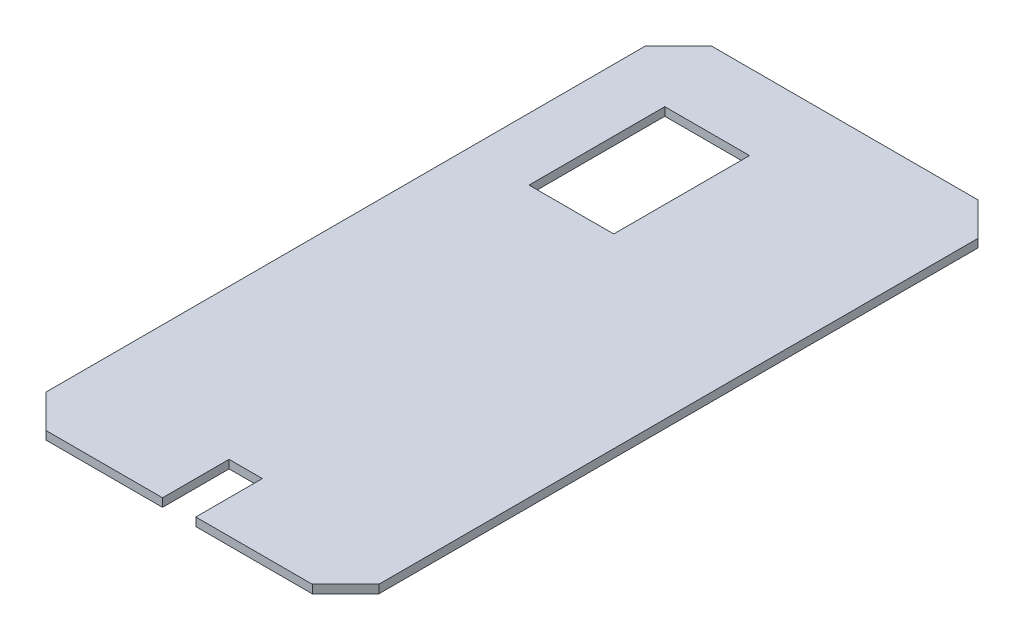
ISO-10303-21;
HEADER;
FILE_DESCRIPTION(('STEP AP214'),'2;1');
FILE_NAME('part.step','',(''),(''),'','','');
FILE_SCHEMA(('AUTOMOTIVE_DESIGN { 1 0 10303 214 1 1 1 1 }'));
ENDSEC;
DATA;
#1=APPLICATION_CONTEXT('core data for automotive mechanical design processes');
#2=APPLICATION_PROTOCOL_DEFINITION('international standard','automotive_design',2000,#1);
#3=PRODUCT_CONTEXT('',#1,'mechanical');
#4=PRODUCT('Part','Part','',(#3));
#5=PRODUCT_RELATED_PRODUCT_CATEGORY('part','',(#4));
#6=PRODUCT_DEFINITION_FORMATION('','',#4);
#7=PRODUCT_DEFINITION_CONTEXT('part definition',#1,'design');
#8=PRODUCT_DEFINITION('design','',#6,#7);
#9=PRODUCT_DEFINITION_SHAPE('','',#8);
#10=(LENGTH_UNIT() NAMED_UNIT(*) SI_UNIT(.MILLI.,.METRE.));
#11=(NAMED_UNIT(*) PLANE_ANGLE_UNIT() SI_UNIT($,.RADIAN.));
#12=(NAMED_UNIT(*) SI_UNIT($,.STERADIAN.) SOLID_ANGLE_UNIT());
#13=UNCERTAINTY_MEASURE_WITH_UNIT(LENGTH_MEASURE(1.E-05),#10,'distance_accuracy_value','');
#14=(GEOMETRIC_REPRESENTATION_CONTEXT(3) GLOBAL_UNCERTAINTY_ASSIGNED_CONTEXT((#13)) GLOBAL_UNIT_ASSIGNED_CONTEXT((#10,
#11,#12)) REPRESENTATION_CONTEXT('',''));
#15=CARTESIAN_POINT('',(0.,0.,0.));
#16=DIRECTION('',(0.,0.,1.));
#17=DIRECTION('',(1.,0.,0.));
#18=AXIS2_PLACEMENT_3D('',#15,#16,#17);
#19=CARTESIAN_POINT('',(0.,3.175,-225.052723408065));
#20=DIRECTION('',(0.,0.,-1.));
#21=DIRECTION('',(-1.,0.,0.));
#22=AXIS2_PLACEMENT_3D('',#19,#20,#21);
#23=PLANE('',#22);
#24=DIRECTION('',(1.,0.,0.));
#25=VECTOR('',#24,1.);
#26=CARTESIAN_POINT('',(0.,0.,-225.052723408065));
#27=LINE('',#26,#25);
#28=CARTESIAN_POINT('',(23.7518882863376,0.,-225.052723408065));
#29=VERTEX_POINT('',#28);
#30=CARTESIAN_POINT('',(56.0621871408209,0.,-225.052723408065));
#31=VERTEX_POINT('',#30);
#32=EDGE_CURVE('E214',#29,#31,#27,.T.);
#33=ORIENTED_EDGE('',*,*,#32,.T.);
#34=DIRECTION('',(0.,-1.,0.));
#35=VECTOR('',#34,1.);
#36=CARTESIAN_POINT('',(56.0621871408209,3.175,-225.052723408065));
#37=LINE('',#36,#35);
#38=CARTESIAN_POINT('',(56.0621871408209,3.175,-225.052723408065));
#39=VERTEX_POINT('',#38);
#40=EDGE_CURVE('E11',#39,#31,#37,.T.);
#41=ORIENTED_EDGE('',*,*,#40,.F.);
#42=DIRECTION('',(1.,0.,0.));
#43=VECTOR('',#42,1.);
#44=CARTESIAN_POINT('',(0.,3.175,-225.052723408065));
#45=LINE('',#44,#43);
#46=CARTESIAN_POINT('',(23.7518882863376,3.175,-225.052723408065));
#47=VERTEX_POINT('',#46);
#48=EDGE_CURVE('E163',#47,#39,#45,.T.);
#49=ORIENTED_EDGE('',*,*,#48,.F.);
#50=DIRECTION('',(0.,-1.,0.));
#51=VECTOR('',#50,1.);
#52=CARTESIAN_POINT('',(23.7518882863376,3.175,-225.052723408065));
#53=LINE('',#52,#51);
#54=EDGE_CURVE('E54',#47,#29,#53,.T.);
#55=ORIENTED_EDGE('',*,*,#54,.T.);
#56=EDGE_LOOP('',(#33,#41,#49,#55));
#57=FACE_BOUND('',#56,.T.);
#58=ADVANCED_FACE('F35',(#57),#23,.F.);
#59=CARTESIAN_POINT('',(56.0621871408209,3.175,0.));
#60=DIRECTION('',(1.,0.,0.));
#61=DIRECTION('',(0.,0.,-1.));
#62=AXIS2_PLACEMENT_3D('',#59,#60,#61);
#63=PLANE('',#62);
#64=DIRECTION('',(0.,0.,1.));
#65=VECTOR('',#64,1.);
#66=CARTESIAN_POINT('',(56.0621871408209,0.,0.));
#67=LINE('',#66,#65);
#68=CARTESIAN_POINT('',(56.0621871408209,0.,-173.247459444421));
#69=VERTEX_POINT('',#68);
#70=EDGE_CURVE('E169',#31,#69,#67,.T.);
#71=ORIENTED_EDGE('',*,*,#70,.T.);
#72=DIRECTION('',(0.,-1.,0.));
#73=VECTOR('',#72,1.);
#74=CARTESIAN_POINT('',(56.0621871408209,3.175,-173.247459444421));
#75=LINE('',#74,#73);
#76=CARTESIAN_POINT('',(56.0621871408209,3.175,-173.247459444421));
#77=VERTEX_POINT('',#76);
#78=EDGE_CURVE('E45',#77,#69,#75,.T.);
#79=ORIENTED_EDGE('',*,*,#78,.F.);
#80=DIRECTION('',(0.,0.,1.));
#81=VECTOR('',#80,1.);
#82=CARTESIAN_POINT('',(56.0621871408209,3.175,0.));
#83=LINE('',#82,#81);
#84=EDGE_CURVE('E157',#39,#77,#83,.T.);
#85=ORIENTED_EDGE('',*,*,#84,.F.);
#86=ORIENTED_EDGE('',*,*,#40,.T.);
#87=EDGE_LOOP('',(#71,#79,#85,#86));
#88=FACE_BOUND('',#87,.T.);
#89=ADVANCED_FACE('F168',(#88),#63,.F.);
#90=CARTESIAN_POINT('',(0.,3.175,-173.247459444421));
#91=DIRECTION('',(0.,0.,-1.));
#92=DIRECTION('',(-1.,0.,0.));
#93=AXIS2_PLACEMENT_3D('',#90,#91,#92);
#94=PLANE('',#93);
#95=DIRECTION('',(1.,0.,0.));
#96=VECTOR('',#95,1.);
#97=CARTESIAN_POINT('',(0.,0.,-173.247459444421));
#98=LINE('',#97,#96);
#99=CARTESIAN_POINT('',(23.7518882863376,0.,-173.247459444421));
#100=VERTEX_POINT('',#99);
#101=EDGE_CURVE('E217',#100,#69,#98,.T.);
#102=ORIENTED_EDGE('',*,*,#101,.F.);
#103=DIRECTION('',(0.,-1.,0.));
#104=VECTOR('',#103,1.);
#105=CARTESIAN_POINT('',(23.7518882863376,3.175,-173.247459444421));
#106=LINE('',#105,#104);
#107=CARTESIAN_POINT('',(23.7518882863376,3.175,-173.247459444421));
#108=VERTEX_POINT('',#107);
#109=EDGE_CURVE('E104',#108,#100,#106,.T.);
#110=ORIENTED_EDGE('',*,*,#109,.F.);
#111=DIRECTION('',(1.,0.,0.));
#112=VECTOR('',#111,1.);
#113=CARTESIAN_POINT('',(0.,3.175,-173.247459444421));
#114=LINE('',#113,#112);
#115=EDGE_CURVE('E162',#108,#77,#114,.T.);
#116=ORIENTED_EDGE('',*,*,#115,.T.);
#117=ORIENTED_EDGE('',*,*,#78,.T.);
#118=EDGE_LOOP('',(#102,#110,#116,#117));
#119=FACE_BOUND('',#118,.T.);
#120=ADVANCED_FACE('F173',(#119),#94,.T.);
#121=CARTESIAN_POINT('',(0.,3.175,-25.4));
#122=DIRECTION('',(0.,0.,-1.));
#123=DIRECTION('',(-1.,0.,0.));
#124=AXIS2_PLACEMENT_3D('',#121,#122,#123);
#125=PLANE('',#124);
#126=DIRECTION('',(1.,0.,0.));
#127=VECTOR('',#126,1.);
#128=CARTESIAN_POINT('',(0.,0.,-25.4));
#129=LINE('',#128,#127);
#130=CARTESIAN_POINT('',(57.1499999999994,0.,-25.4));
#131=VERTEX_POINT('',#130);
#132=CARTESIAN_POINT('',(69.8499999999994,0.,-25.4));
#133=VERTEX_POINT('',#132);
#134=EDGE_CURVE('E180',#131,#133,#129,.T.);
#135=ORIENTED_EDGE('',*,*,#134,.T.);
#136=DIRECTION('',(0.,-1.,0.));
#137=VECTOR('',#136,1.);
#138=CARTESIAN_POINT('',(69.8499999999994,3.175,-25.4));
#139=LINE('',#138,#137);
#140=CARTESIAN_POINT('',(69.8499999999994,3.175,-25.4));
#141=VERTEX_POINT('',#140);
#142=EDGE_CURVE('E39',#141,#133,#139,.T.);
#143=ORIENTED_EDGE('',*,*,#142,.F.);
#144=DIRECTION('',(1.,0.,0.));
#145=VECTOR('',#144,1.);
#146=CARTESIAN_POINT('',(0.,3.175,-25.4));
#147=LINE('',#146,#145);
#148=CARTESIAN_POINT('',(57.1499999999994,3.175,-25.4));
#149=VERTEX_POINT('',#148);
#150=EDGE_CURVE('E222',#149,#141,#147,.T.);
#151=ORIENTED_EDGE('',*,*,#150,.F.);
#152=DIRECTION('',(0.,-1.,0.));
#153=VECTOR('',#152,1.);
#154=CARTESIAN_POINT('',(57.1499999999994,3.175,-25.4));
#155=LINE('',#154,#153);
#156=EDGE_CURVE('E176',#149,#131,#155,.T.);
#157=ORIENTED_EDGE('',*,*,#156,.T.);
#158=EDGE_LOOP('',(#135,#143,#151,#157));
#159=FACE_BOUND('',#158,.T.);
#160=ADVANCED_FACE('F37',(#159),#125,.F.);
#161=CARTESIAN_POINT('',(69.8499999999994,3.175,0.));
#162=DIRECTION('',(1.,0.,0.));
#163=DIRECTION('',(0.,0.,-1.));
#164=AXIS2_PLACEMENT_3D('',#161,#162,#163);
#165=PLANE('',#164);
#166=DIRECTION('',(0.,0.,1.));
#167=VECTOR('',#166,1.);
#168=CARTESIAN_POINT('',(69.8499999999994,0.,0.));
#169=LINE('',#168,#167);
#170=CARTESIAN_POINT('',(69.8499999999994,0.,0.));
#171=VERTEX_POINT('',#170);
#172=EDGE_CURVE('E183',#133,#171,#169,.T.);
#173=ORIENTED_EDGE('',*,*,#172,.T.);
#174=DIRECTION('',(0.,-1.,0.));
#175=VECTOR('',#174,1.);
#176=CARTESIAN_POINT('',(69.8499999999994,3.175,0.));
#177=LINE('',#176,#175);
#178=CARTESIAN_POINT('',(69.8499999999994,3.175,0.));
#179=VERTEX_POINT('',#178);
#180=EDGE_CURVE('E243',#179,#171,#177,.T.);
#181=ORIENTED_EDGE('',*,*,#180,.F.);
#182=DIRECTION('',(0.,0.,1.));
#183=VECTOR('',#182,1.);
#184=CARTESIAN_POINT('',(69.8499999999994,3.175,0.));
#185=LINE('',#184,#183);
#186=EDGE_CURVE('E117',#141,#179,#185,.T.);
#187=ORIENTED_EDGE('',*,*,#186,.F.);
#188=ORIENTED_EDGE('',*,*,#142,.T.);
#189=EDGE_LOOP('',(#173,#181,#187,#188));
#190=FACE_BOUND('',#189,.T.);
#191=ADVANCED_FACE('F248',(#190),#165,.F.);
#192=CARTESIAN_POINT('',(0.,3.175,0.));
#193=DIRECTION('',(0.,0.,1.));
#194=DIRECTION('',(1.,0.,0.));
#195=AXIS2_PLACEMENT_3D('',#192,#193,#194);
#196=PLANE('',#195);
#197=DIRECTION('',(-1.,0.,0.));
#198=VECTOR('',#197,1.);
#199=CARTESIAN_POINT('',(0.,0.,0.));
#200=LINE('',#199,#198);
#201=CARTESIAN_POINT('',(114.299999999999,0.,0.));
#202=VERTEX_POINT('',#201);
#203=EDGE_CURVE('E186',#202,#171,#200,.T.);
#204=ORIENTED_EDGE('',*,*,#203,.F.);
#205=DIRECTION('',(0.,-1.,0.));
#206=VECTOR('',#205,1.);
#207=CARTESIAN_POINT('',(114.299999999999,3.175,0.));
#208=LINE('',#207,#206);
#209=CARTESIAN_POINT('',(114.299999999999,3.175,0.));
#210=VERTEX_POINT('',#209);
#211=EDGE_CURVE('E242',#210,#202,#208,.T.);
#212=ORIENTED_EDGE('',*,*,#211,.F.);
#213=DIRECTION('',(-1.,0.,0.));
#214=VECTOR('',#213,1.);
#215=CARTESIAN_POINT('',(0.,3.175,0.));
#216=LINE('',#215,#214);
#217=EDGE_CURVE('E464',#210,#179,#216,.T.);
#218=ORIENTED_EDGE('',*,*,#217,.T.);
#219=ORIENTED_EDGE('',*,*,#180,.T.);
#220=EDGE_LOOP('',(#204,#212,#218,#219));
#221=FACE_BOUND('',#220,.T.);
#222=ADVANCED_FACE('F308',(#221),#196,.T.);
#223=CARTESIAN_POINT('',(57.1500000000001,3.175,57.1499999999997));
#224=DIRECTION('',(0.70710678118655,0.,0.707106781186545));
#225=DIRECTION('',(0.707106781186545,0.,-0.70710678118655));
#226=AXIS2_PLACEMENT_3D('',#223,#224,#225);
#227=PLANE('',#226);
#228=DIRECTION('',(-0.707106781186545,0.,0.70710678118655));
#229=VECTOR('',#228,1.);
#230=CARTESIAN_POINT('',(57.1500000000001,0.,57.1499999999997));
#231=LINE('',#230,#229);
#232=CARTESIAN_POINT('',(127.,0.,-12.7000000000002));
#233=VERTEX_POINT('',#232);
#234=EDGE_CURVE('E189',#233,#202,#231,.T.);
#235=ORIENTED_EDGE('',*,*,#234,.F.);
#236=DIRECTION('',(0.,-1.,0.));
#237=VECTOR('',#236,1.);
#238=CARTESIAN_POINT('',(127.,3.175,-12.7000000000002));
#239=LINE('',#238,#237);
#240=CARTESIAN_POINT('',(127.,3.175,-12.7000000000002));
#241=VERTEX_POINT('',#240);
#242=EDGE_CURVE('E240',#241,#233,#239,.T.);
#243=ORIENTED_EDGE('',*,*,#242,.F.);
#244=DIRECTION('',(-0.707106781186545,0.,0.70710678118655));
#245=VECTOR('',#244,1.);
#246=CARTESIAN_POINT('',(57.1500000000001,3.175,57.1499999999997));
#247=LINE('',#246,#245);
#248=EDGE_CURVE('E306',#241,#210,#247,.T.);
#249=ORIENTED_EDGE('',*,*,#248,.T.);
#250=ORIENTED_EDGE('',*,*,#211,.T.);
#251=EDGE_LOOP('',(#235,#243,#249,#250));
#252=FACE_BOUND('',#251,.T.);
#253=ADVANCED_FACE('F303',(#252),#227,.T.);
#254=CARTESIAN_POINT('',(127.,3.175,0.));
#255=DIRECTION('',(1.,0.,0.));
#256=DIRECTION('',(0.,0.,-1.));
#257=AXIS2_PLACEMENT_3D('',#254,#255,#256);
#258=PLANE('',#257);
#259=DIRECTION('',(0.,0.,1.));
#260=VECTOR('',#259,1.);
#261=CARTESIAN_POINT('',(127.,0.,0.));
#262=LINE('',#261,#260);
#263=CARTESIAN_POINT('',(127.,0.,-241.3));
#264=VERTEX_POINT('',#263);
#265=EDGE_CURVE('E193',#264,#233,#262,.T.);
#266=ORIENTED_EDGE('',*,*,#265,.F.);
#267=DIRECTION('',(0.,-1.,0.));
#268=VECTOR('',#267,1.);
#269=CARTESIAN_POINT('',(127.,3.175,-241.3));
#270=LINE('',#269,#268);
#271=CARTESIAN_POINT('',(127.,3.175,-241.3));
#272=VERTEX_POINT('',#271);
#273=EDGE_CURVE('E238',#272,#264,#270,.T.);
#274=ORIENTED_EDGE('',*,*,#273,.F.);
#275=DIRECTION('',(0.,0.,1.));
#276=VECTOR('',#275,1.);
#277=CARTESIAN_POINT('',(127.,3.175,0.));
#278=LINE('',#277,#276);
#279=EDGE_CURVE('E461',#272,#241,#278,.T.);
#280=ORIENTED_EDGE('',*,*,#279,.T.);
#281=ORIENTED_EDGE('',*,*,#242,.T.);
#282=EDGE_LOOP('',(#266,#274,#280,#281));
#283=FACE_BOUND('',#282,.T.);
#284=ADVANCED_FACE('F300',(#283),#258,.T.);
#285=CARTESIAN_POINT('',(184.149999999996,3.175,-184.150000000006));
#286=DIRECTION('',(0.707106781186529,0.,-0.707106781186566));
#287=DIRECTION('',(-0.707106781186566,0.,-0.707106781186529));
#288=AXIS2_PLACEMENT_3D('',#285,#286,#287);
#289=PLANE('',#288);
#290=DIRECTION('',(0.707106781186566,0.,0.707106781186529));
#291=VECTOR('',#290,1.);
#292=CARTESIAN_POINT('',(184.149999999996,0.,-184.150000000006));
#293=LINE('',#292,#291);
#294=CARTESIAN_POINT('',(114.299999999999,0.,-254.));
#295=VERTEX_POINT('',#294);
#296=EDGE_CURVE('E196',#295,#264,#293,.T.);
#297=ORIENTED_EDGE('',*,*,#296,.F.);
#298=DIRECTION('',(0.,-1.,0.));
#299=VECTOR('',#298,1.);
#300=CARTESIAN_POINT('',(114.299999999999,3.175,-254.));
#301=LINE('',#300,#299);
#302=CARTESIAN_POINT('',(114.299999999999,3.175,-254.));
#303=VERTEX_POINT('',#302);
#304=EDGE_CURVE('E236',#303,#295,#301,.T.);
#305=ORIENTED_EDGE('',*,*,#304,.F.);
#306=DIRECTION('',(0.707106781186566,0.,0.707106781186529));
#307=VECTOR('',#306,1.);
#308=CARTESIAN_POINT('',(184.149999999996,3.175,-184.150000000006));
#309=LINE('',#308,#307);
#310=EDGE_CURVE('E296',#303,#272,#309,.T.);
#311=ORIENTED_EDGE('',*,*,#310,.T.);
#312=ORIENTED_EDGE('',*,*,#273,.T.);
#313=EDGE_LOOP('',(#297,#305,#311,#312));
#314=FACE_BOUND('',#313,.T.);
#315=ADVANCED_FACE('F294',(#314),#289,.T.);
#316=CARTESIAN_POINT('',(0.,3.175,-254.));
#317=DIRECTION('',(0.,0.,-1.));
#318=DIRECTION('',(-1.,0.,0.));
#319=AXIS2_PLACEMENT_3D('',#316,#317,#318);
#320=PLANE('',#319);
#321=DIRECTION('',(1.,0.,0.));
#322=VECTOR('',#321,1.);
#323=CARTESIAN_POINT('',(0.,0.,-254.));
#324=LINE('',#323,#322);
#325=CARTESIAN_POINT('',(12.6999999999995,0.,-254.));
#326=VERTEX_POINT('',#325);
#327=EDGE_CURVE('E199',#326,#295,#324,.T.);
#328=ORIENTED_EDGE('',*,*,#327,.F.);
#329=DIRECTION('',(0.,-1.,0.));
#330=VECTOR('',#329,1.);
#331=CARTESIAN_POINT('',(12.6999999999995,3.175,-254.));
#332=LINE('',#331,#330);
#333=CARTESIAN_POINT('',(12.6999999999995,3.175,-254.));
#334=VERTEX_POINT('',#333);
#335=EDGE_CURVE('E234',#334,#326,#332,.T.);
#336=ORIENTED_EDGE('',*,*,#335,.F.);
#337=DIRECTION('',(1.,0.,0.));
#338=VECTOR('',#337,1.);
#339=CARTESIAN_POINT('',(0.,3.175,-254.));
#340=LINE('',#339,#338);
#341=EDGE_CURVE('E290',#334,#303,#340,.T.);
#342=ORIENTED_EDGE('',*,*,#341,.T.);
#343=ORIENTED_EDGE('',*,*,#304,.T.);
#344=EDGE_LOOP('',(#328,#336,#342,#343));
#345=FACE_BOUND('',#344,.T.);
#346=ADVANCED_FACE('F287',(#345),#320,.T.);
#347=CARTESIAN_POINT('',(-120.65,3.175,-120.650000000003));
#348=DIRECTION('',(-0.70710678118654,0.,-0.707106781186555));
#349=DIRECTION('',(-0.707106781186555,0.,0.70710678118654));
#350=AXIS2_PLACEMENT_3D('',#347,#348,#349);
#351=PLANE('',#350);
#352=DIRECTION('',(0.707106781186555,0.,-0.70710678118654));
#353=VECTOR('',#352,1.);
#354=CARTESIAN_POINT('',(-120.65,0.,-120.650000000003));
#355=LINE('',#354,#353);
#356=CARTESIAN_POINT('',(-5.00964118166406E-13,0.,-241.3));
#357=VERTEX_POINT('',#356);
#358=EDGE_CURVE('E202',#357,#326,#355,.T.);
#359=ORIENTED_EDGE('',*,*,#358,.F.);
#360=DIRECTION('',(0.,-1.,0.));
#361=VECTOR('',#360,1.);
#362=CARTESIAN_POINT('',(-5.00964118166406E-13,3.175,-241.3));
#363=LINE('',#362,#361);
#364=CARTESIAN_POINT('',(-5.00964118166406E-13,3.175,-241.3));
#365=VERTEX_POINT('',#364);
#366=EDGE_CURVE('E232',#365,#357,#363,.T.);
#367=ORIENTED_EDGE('',*,*,#366,.F.);
#368=DIRECTION('',(0.707106781186555,0.,-0.70710678118654));
#369=VECTOR('',#368,1.);
#370=CARTESIAN_POINT('',(-120.65,3.175,-120.650000000003));
#371=LINE('',#370,#369);
#372=EDGE_CURVE('E457',#365,#334,#371,.T.);
#373=ORIENTED_EDGE('',*,*,#372,.T.);
#374=ORIENTED_EDGE('',*,*,#335,.T.);
#375=EDGE_LOOP('',(#359,#367,#373,#374));
#376=FACE_BOUND('',#375,.T.);
#377=ADVANCED_FACE('F283',(#376),#351,.T.);
#378=CARTESIAN_POINT('',(-5.03480726483334E-13,3.175,0.));
#379=DIRECTION('',(-1.,0.,0.));
#380=DIRECTION('',(0.,0.,1.));
#381=AXIS2_PLACEMENT_3D('',#378,#379,#380);
#382=PLANE('',#381);
#383=DIRECTION('',(0.,0.,-1.));
#384=VECTOR('',#383,1.);
#385=CARTESIAN_POINT('',(-5.03480726483334E-13,0.,0.));
#386=LINE('',#385,#384);
#387=CARTESIAN_POINT('',(-5.03348273414022E-13,0.,-12.7));
#388=VERTEX_POINT('',#387);
#389=EDGE_CURVE('E205',#388,#357,#386,.T.);
#390=ORIENTED_EDGE('',*,*,#389,.F.);
#391=DIRECTION('',(0.,-1.,0.));
#392=VECTOR('',#391,1.);
#393=CARTESIAN_POINT('',(-5.03348273414022E-13,3.175,-12.7));
#394=LINE('',#393,#392);
#395=CARTESIAN_POINT('',(-5.03348273414022E-13,3.175,-12.7));
#396=VERTEX_POINT('',#395);
#397=EDGE_CURVE('E230',#396,#388,#394,.T.);
#398=ORIENTED_EDGE('',*,*,#397,.F.);
#399=DIRECTION('',(0.,0.,-1.));
#400=VECTOR('',#399,1.);
#401=CARTESIAN_POINT('',(-5.03480726483334E-13,3.175,0.));
#402=LINE('',#401,#400);
#403=EDGE_CURVE('E279',#396,#365,#402,.T.);
#404=ORIENTED_EDGE('',*,*,#403,.T.);
#405=ORIENTED_EDGE('',*,*,#366,.T.);
#406=EDGE_LOOP('',(#390,#398,#404,#405));
#407=FACE_BOUND('',#406,.T.);
#408=ADVANCED_FACE('F277',(#407),#382,.T.);
#409=CARTESIAN_POINT('',(6.34999999999973,3.175,-6.34999999999975));
#410=DIRECTION('',(-0.707106781186547,0.,0.707106781186548));
#411=DIRECTION('',(0.707106781186548,0.,0.707106781186547));
#412=AXIS2_PLACEMENT_3D('',#409,#410,#411);
#413=PLANE('',#412);
#414=DIRECTION('',(-0.707106781186548,0.,-0.707106781186547));
#415=VECTOR('',#414,1.);
#416=CARTESIAN_POINT('',(6.34999999999973,0.,-6.34999999999975));
#417=LINE('',#416,#415);
#418=CARTESIAN_POINT('',(12.6999999999995,0.,0.));
#419=VERTEX_POINT('',#418);
#420=EDGE_CURVE('E208',#419,#388,#417,.T.);
#421=ORIENTED_EDGE('',*,*,#420,.F.);
#422=DIRECTION('',(0.,-1.,0.));
#423=VECTOR('',#422,1.);
#424=CARTESIAN_POINT('',(12.6999999999995,3.175,0.));
#425=LINE('',#424,#423);
#426=CARTESIAN_POINT('',(12.6999999999995,3.175,0.));
#427=VERTEX_POINT('',#426);
#428=EDGE_CURVE('E228',#427,#419,#425,.T.);
#429=ORIENTED_EDGE('',*,*,#428,.F.);
#430=DIRECTION('',(-0.707106781186548,0.,-0.707106781186547));
#431=VECTOR('',#430,1.);
#432=CARTESIAN_POINT('',(6.34999999999973,3.175,-6.34999999999975));
#433=LINE('',#432,#431);
#434=EDGE_CURVE('E273',#427,#396,#433,.T.);
#435=ORIENTED_EDGE('',*,*,#434,.T.);
#436=ORIENTED_EDGE('',*,*,#397,.T.);
#437=EDGE_LOOP('',(#421,#429,#435,#436));
#438=FACE_BOUND('',#437,.T.);
#439=ADVANCED_FACE('F270',(#438),#413,.T.);
#440=CARTESIAN_POINT('',(57.1499999999994,0.,0.));
#441=VERTEX_POINT('',#440);
#442=EDGE_CURVE('E190',#441,#419,#200,.T.);
#443=ORIENTED_EDGE('',*,*,#442,.F.);
#444=DIRECTION('',(0.,-1.,0.));
#445=VECTOR('',#444,1.);
#446=CARTESIAN_POINT('',(57.1499999999994,3.175,0.));
#447=LINE('',#446,#445);
#448=CARTESIAN_POINT('',(57.1499999999994,3.175,0.));
#449=VERTEX_POINT('',#448);
#450=EDGE_CURVE('E226',#449,#441,#447,.T.);
#451=ORIENTED_EDGE('',*,*,#450,.F.);
#452=EDGE_CURVE('E452',#449,#427,#216,.T.);
#453=ORIENTED_EDGE('',*,*,#452,.T.);
#454=ORIENTED_EDGE('',*,*,#428,.T.);
#455=EDGE_LOOP('',(#443,#451,#453,#454));
#456=FACE_BOUND('',#455,.T.);
#457=ADVANCED_FACE('F266',(#456),#196,.T.);
#458=CARTESIAN_POINT('',(57.1499999999994,3.175,0.));
#459=DIRECTION('',(1.,0.,0.));
#460=DIRECTION('',(0.,0.,-1.));
#461=AXIS2_PLACEMENT_3D('',#458,#459,#460);
#462=PLANE('',#461);
#463=DIRECTION('',(0.,0.,1.));
#464=VECTOR('',#463,1.);
#465=CARTESIAN_POINT('',(57.1499999999994,0.,0.));
#466=LINE('',#465,#464);
#467=EDGE_CURVE('E211',#131,#441,#466,.T.);
#468=ORIENTED_EDGE('',*,*,#467,.F.);
#469=ORIENTED_EDGE('',*,*,#156,.F.);
#470=DIRECTION('',(0.,0.,1.));
#471=VECTOR('',#470,1.);
#472=CARTESIAN_POINT('',(57.1499999999994,3.175,0.));
#473=LINE('',#472,#471);
#474=EDGE_CURVE('E262',#149,#449,#473,.T.);
#475=ORIENTED_EDGE('',*,*,#474,.T.);
#476=ORIENTED_EDGE('',*,*,#450,.T.);
#477=EDGE_LOOP('',(#468,#469,#475,#476));
#478=FACE_BOUND('',#477,.T.);
#479=ADVANCED_FACE('F258',(#478),#462,.T.);
#480=CARTESIAN_POINT('',(23.7518882863376,3.175,0.));
#481=DIRECTION('',(1.,0.,0.));
#482=DIRECTION('',(0.,0.,-1.));
#483=AXIS2_PLACEMENT_3D('',#480,#481,#482);
#484=PLANE('',#483);
#485=DIRECTION('',(0.,0.,1.));
#486=VECTOR('',#485,1.);
#487=CARTESIAN_POINT('',(23.7518882863376,0.,0.));
#488=LINE('',#487,#486);
#489=EDGE_CURVE('E219',#29,#100,#488,.T.);
#490=ORIENTED_EDGE('',*,*,#489,.F.);
#491=ORIENTED_EDGE('',*,*,#54,.F.);
#492=DIRECTION('',(0.,0.,1.));
#493=VECTOR('',#492,1.);
#494=CARTESIAN_POINT('',(23.7518882863376,3.175,0.));
#495=LINE('',#494,#493);
#496=EDGE_CURVE('E174',#47,#108,#495,.T.);
#497=ORIENTED_EDGE('',*,*,#496,.T.);
#498=ORIENTED_EDGE('',*,*,#109,.T.);
#499=EDGE_LOOP('',(#490,#491,#497,#498));
#500=FACE_BOUND('',#499,.T.);
#501=ADVANCED_FACE('F327',(#500),#484,.T.);
#502=CARTESIAN_POINT('',(0.,3.175,0.));
#503=DIRECTION('',(0.,1.,0.));
#504=DIRECTION('',(0.,0.,1.));
#505=AXIS2_PLACEMENT_3D('',#502,#503,#504);
#506=PLANE('',#505);
#507=ORIENTED_EDGE('',*,*,#150,.T.);
#508=ORIENTED_EDGE('',*,*,#186,.T.);
#509=ORIENTED_EDGE('',*,*,#217,.F.);
#510=ORIENTED_EDGE('',*,*,#248,.F.);
#511=ORIENTED_EDGE('',*,*,#279,.F.);
#512=ORIENTED_EDGE('',*,*,#310,.F.);
#513=ORIENTED_EDGE('',*,*,#341,.F.);
#514=ORIENTED_EDGE('',*,*,#372,.F.);
#515=ORIENTED_EDGE('',*,*,#403,.F.);
#516=ORIENTED_EDGE('',*,*,#434,.F.);
#517=ORIENTED_EDGE('',*,*,#452,.F.);
#518=ORIENTED_EDGE('',*,*,#474,.F.);
#519=EDGE_LOOP('',(#507,#508,#509,#510,#511,#512,#513,#514,#515,#516,#517,#518));
#520=FACE_BOUND('',#519,.T.);
#521=ORIENTED_EDGE('',*,*,#48,.T.);
#522=ORIENTED_EDGE('',*,*,#84,.T.);
#523=ORIENTED_EDGE('',*,*,#115,.F.);
#524=ORIENTED_EDGE('',*,*,#496,.F.);
#525=EDGE_LOOP('',(#521,#522,#523,#524));
#526=FACE_BOUND('',#525,.T.);
#527=ADVANCED_FACE('F159',(#520,#526),#506,.T.);
#528=CARTESIAN_POINT('',(0.,0.,0.));
#529=DIRECTION('',(0.,1.,0.));
#530=DIRECTION('',(0.,0.,1.));
#531=AXIS2_PLACEMENT_3D('',#528,#529,#530);
#532=PLANE('',#531);
#533=ORIENTED_EDGE('',*,*,#134,.F.);
#534=ORIENTED_EDGE('',*,*,#467,.T.);
#535=ORIENTED_EDGE('',*,*,#442,.T.);
#536=ORIENTED_EDGE('',*,*,#420,.T.);
#537=ORIENTED_EDGE('',*,*,#389,.T.);
#538=ORIENTED_EDGE('',*,*,#358,.T.);
#539=ORIENTED_EDGE('',*,*,#327,.T.);
#540=ORIENTED_EDGE('',*,*,#296,.T.);
#541=ORIENTED_EDGE('',*,*,#265,.T.);
#542=ORIENTED_EDGE('',*,*,#234,.T.);
#543=ORIENTED_EDGE('',*,*,#203,.T.);
#544=ORIENTED_EDGE('',*,*,#172,.F.);
#545=EDGE_LOOP('',(#533,#534,#535,#536,#537,#538,#539,#540,#541,#542,#543,#544));
#546=FACE_BOUND('',#545,.T.);
#547=ORIENTED_EDGE('',*,*,#32,.F.);
#548=ORIENTED_EDGE('',*,*,#489,.T.);
#549=ORIENTED_EDGE('',*,*,#101,.T.);
#550=ORIENTED_EDGE('',*,*,#70,.F.);
#551=EDGE_LOOP('',(#547,#548,#549,#550));
#552=FACE_BOUND('',#551,.T.);
#553=ADVANCED_FACE('F254',(#546,#552),#532,.F.);
#554=CLOSED_SHELL('',(#58,#89,#120,#160,#191,#222,#253,#284,#315,#346,#377,#408,#439,#457,#479,
#501,#527,#553));
#555=MANIFOLD_SOLID_BREP('B2',#554);
#556=ADVANCED_BREP_SHAPE_REPRESENTATION('',(#18,#555),#14);
#557=SHAPE_DEFINITION_REPRESENTATION(#9,#556);
ENDSEC;
END-ISO-10303-21;
